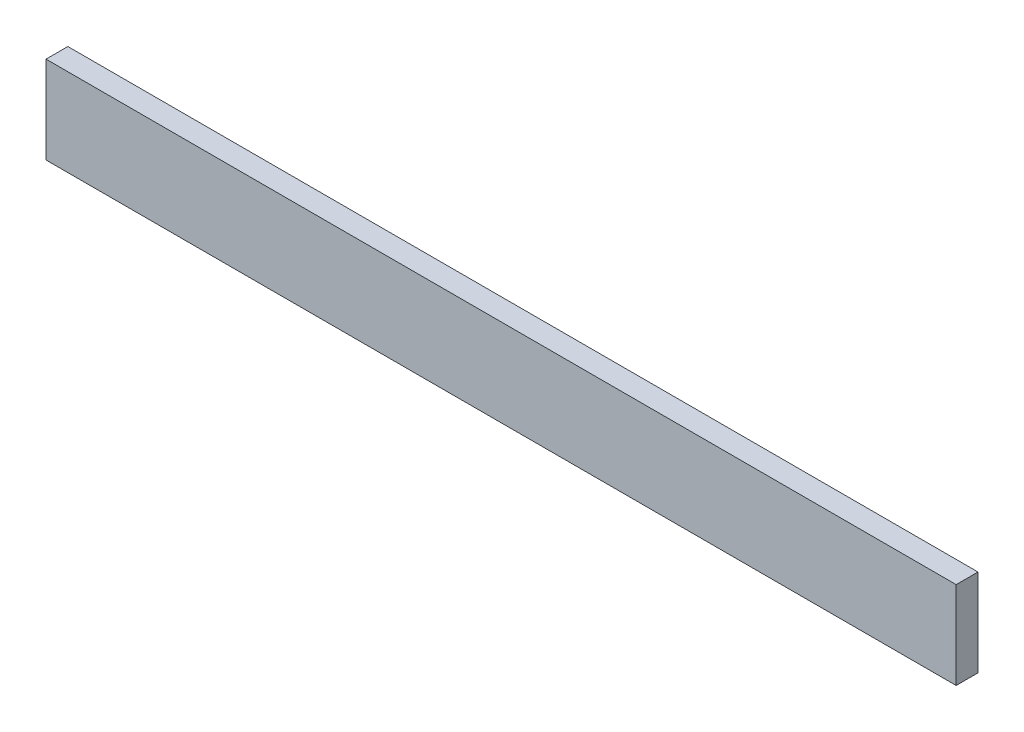
ISO-10303-21;
HEADER;
FILE_DESCRIPTION(('STEP AP214'),'2;1');
FILE_NAME('part.step','',(''),(''),'','','');
FILE_SCHEMA(('AUTOMOTIVE_DESIGN { 1 0 10303 214 1 1 1 1 }'));
ENDSEC;
DATA;
#1=APPLICATION_CONTEXT('core data for automotive mechanical design processes');
#2=APPLICATION_PROTOCOL_DEFINITION('international standard','automotive_design',2000,#1);
#3=PRODUCT_CONTEXT('',#1,'mechanical');
#4=PRODUCT('Part','Part','',(#3));
#5=PRODUCT_RELATED_PRODUCT_CATEGORY('part','',(#4));
#6=PRODUCT_DEFINITION_FORMATION('','',#4);
#7=PRODUCT_DEFINITION_CONTEXT('part definition',#1,'design');
#8=PRODUCT_DEFINITION('design','',#6,#7);
#9=PRODUCT_DEFINITION_SHAPE('','',#8);
#10=(LENGTH_UNIT() NAMED_UNIT(*) SI_UNIT(.MILLI.,.METRE.));
#11=(NAMED_UNIT(*) PLANE_ANGLE_UNIT() SI_UNIT($,.RADIAN.));
#12=(NAMED_UNIT(*) SI_UNIT($,.STERADIAN.) SOLID_ANGLE_UNIT());
#13=UNCERTAINTY_MEASURE_WITH_UNIT(LENGTH_MEASURE(1.E-05),#10,'distance_accuracy_value','');
#14=(GEOMETRIC_REPRESENTATION_CONTEXT(3) GLOBAL_UNCERTAINTY_ASSIGNED_CONTEXT((#13)) GLOBAL_UNIT_ASSIGNED_CONTEXT((#10,
#11,#12)) REPRESENTATION_CONTEXT('',''));
#15=CARTESIAN_POINT('',(0.,0.,0.));
#16=DIRECTION('',(0.,0.,1.));
#17=DIRECTION('',(1.,0.,0.));
#18=AXIS2_PLACEMENT_3D('',#15,#16,#17);
#19=CARTESIAN_POINT('',(29.2226202661208,-12.,3.));
#20=DIRECTION('',(-1.,0.,0.));
#21=DIRECTION('',(0.,0.,1.));
#22=AXIS2_PLACEMENT_3D('',#19,#20,#21);
#23=PLANE('',#22);
#24=DIRECTION('',(0.,1.,0.));
#25=VECTOR('',#24,1.);
#26=CARTESIAN_POINT('',(29.2226202661208,-12.,0.));
#27=LINE('',#26,#25);
#28=CARTESIAN_POINT('',(29.2226202661208,-12.,0.));
#29=VERTEX_POINT('',#28);
#30=CARTESIAN_POINT('',(29.2226202661208,0.,0.));
#31=VERTEX_POINT('',#30);
#32=EDGE_CURVE('E102',#29,#31,#27,.T.);
#33=ORIENTED_EDGE('',*,*,#32,.T.);
#34=DIRECTION('',(0.,0.,-1.));
#35=VECTOR('',#34,1.);
#36=CARTESIAN_POINT('',(29.2226202661208,0.,3.));
#37=LINE('',#36,#35);
#38=CARTESIAN_POINT('',(29.2226202661208,0.,3.));
#39=VERTEX_POINT('',#38);
#40=EDGE_CURVE('E11',#39,#31,#37,.T.);
#41=ORIENTED_EDGE('',*,*,#40,.F.);
#42=DIRECTION('',(0.,1.,0.));
#43=VECTOR('',#42,1.);
#44=CARTESIAN_POINT('',(29.2226202661208,-12.,3.));
#45=LINE('',#44,#43);
#46=CARTESIAN_POINT('',(29.2226202661208,-12.,3.));
#47=VERTEX_POINT('',#46);
#48=EDGE_CURVE('E90',#47,#39,#45,.T.);
#49=ORIENTED_EDGE('',*,*,#48,.F.);
#50=DIRECTION('',(0.,0.,-1.));
#51=VECTOR('',#50,1.);
#52=CARTESIAN_POINT('',(29.2226202661208,-12.,3.));
#53=LINE('',#52,#51);
#54=EDGE_CURVE('E98',#47,#29,#53,.T.);
#55=ORIENTED_EDGE('',*,*,#54,.T.);
#56=EDGE_LOOP('',(#33,#41,#49,#55));
#57=FACE_BOUND('',#56,.T.);
#58=ADVANCED_FACE('F39',(#57),#23,.F.);
#59=CARTESIAN_POINT('',(-83.7773797338792,0.,3.));
#60=DIRECTION('',(0.,-1.,0.));
#61=DIRECTION('',(0.,0.,-1.));
#62=AXIS2_PLACEMENT_3D('',#59,#60,#61);
#63=PLANE('',#62);
#64=DIRECTION('',(-1.,0.,0.));
#65=VECTOR('',#64,1.);
#66=CARTESIAN_POINT('',(-83.7773797338792,0.,0.));
#67=LINE('',#66,#65);
#68=CARTESIAN_POINT('',(-95.7773797338792,0.,0.));
#69=VERTEX_POINT('',#68);
#70=EDGE_CURVE('E94',#31,#69,#67,.T.);
#71=ORIENTED_EDGE('',*,*,#70,.T.);
#72=DIRECTION('',(0.,0.,-1.));
#73=VECTOR('',#72,1.);
#74=CARTESIAN_POINT('',(-95.7773797338792,0.,3.));
#75=LINE('',#74,#73);
#76=CARTESIAN_POINT('',(-95.7773797338792,0.,3.));
#77=VERTEX_POINT('',#76);
#78=EDGE_CURVE('E47',#77,#69,#75,.T.);
#79=ORIENTED_EDGE('',*,*,#78,.F.);
#80=DIRECTION('',(-1.,0.,0.));
#81=VECTOR('',#80,1.);
#82=CARTESIAN_POINT('',(17.2226202661208,0.,3.));
#83=LINE('',#82,#81);
#84=EDGE_CURVE('E85',#39,#77,#83,.T.);
#85=ORIENTED_EDGE('',*,*,#84,.F.);
#86=ORIENTED_EDGE('',*,*,#40,.T.);
#87=EDGE_LOOP('',(#71,#79,#85,#86));
#88=FACE_BOUND('',#87,.T.);
#89=ADVANCED_FACE('F93',(#88),#63,.F.);
#90=CARTESIAN_POINT('',(-95.7773797338792,0.,3.));
#91=DIRECTION('',(1.,0.,0.));
#92=DIRECTION('',(0.,0.,-1.));
#93=AXIS2_PLACEMENT_3D('',#90,#91,#92);
#94=PLANE('',#93);
#95=DIRECTION('',(0.,-1.,0.));
#96=VECTOR('',#95,1.);
#97=CARTESIAN_POINT('',(-95.7773797338792,0.,0.));
#98=LINE('',#97,#96);
#99=CARTESIAN_POINT('',(-95.7773797338792,-12.,0.));
#100=VERTEX_POINT('',#99);
#101=EDGE_CURVE('E72',#69,#100,#98,.T.);
#102=ORIENTED_EDGE('',*,*,#101,.T.);
#103=DIRECTION('',(0.,0.,-1.));
#104=VECTOR('',#103,1.);
#105=CARTESIAN_POINT('',(-95.7773797338792,-12.,3.));
#106=LINE('',#105,#104);
#107=CARTESIAN_POINT('',(-95.7773797338792,-12.,3.));
#108=VERTEX_POINT('',#107);
#109=EDGE_CURVE('E95',#108,#100,#106,.T.);
#110=ORIENTED_EDGE('',*,*,#109,.F.);
#111=DIRECTION('',(0.,-1.,0.));
#112=VECTOR('',#111,1.);
#113=CARTESIAN_POINT('',(-95.7773797338792,0.,3.));
#114=LINE('',#113,#112);
#115=EDGE_CURVE('E88',#77,#108,#114,.T.);
#116=ORIENTED_EDGE('',*,*,#115,.F.);
#117=ORIENTED_EDGE('',*,*,#78,.T.);
#118=EDGE_LOOP('',(#102,#110,#116,#117));
#119=FACE_BOUND('',#118,.T.);
#120=ADVANCED_FACE('F96',(#119),#94,.F.);
#121=CARTESIAN_POINT('',(-95.7773797338792,-12.,3.));
#122=DIRECTION('',(0.,1.,0.));
#123=DIRECTION('',(0.,0.,1.));
#124=AXIS2_PLACEMENT_3D('',#121,#122,#123);
#125=PLANE('',#124);
#126=DIRECTION('',(1.,0.,0.));
#127=VECTOR('',#126,1.);
#128=CARTESIAN_POINT('',(-95.7773797338792,-12.,0.));
#129=LINE('',#128,#127);
#130=EDGE_CURVE('E78',#100,#29,#129,.T.);
#131=ORIENTED_EDGE('',*,*,#130,.T.);
#132=ORIENTED_EDGE('',*,*,#54,.F.);
#133=DIRECTION('',(1.,0.,0.));
#134=VECTOR('',#133,1.);
#135=CARTESIAN_POINT('',(-95.7773797338792,-12.,3.));
#136=LINE('',#135,#134);
#137=EDGE_CURVE('E55',#108,#47,#136,.T.);
#138=ORIENTED_EDGE('',*,*,#137,.F.);
#139=ORIENTED_EDGE('',*,*,#109,.T.);
#140=EDGE_LOOP('',(#131,#132,#138,#139));
#141=FACE_BOUND('',#140,.T.);
#142=ADVANCED_FACE('F109',(#141),#125,.F.);
#143=CARTESIAN_POINT('',(0.,0.,3.));
#144=DIRECTION('',(0.,0.,-1.));
#145=DIRECTION('',(-1.,0.,0.));
#146=AXIS2_PLACEMENT_3D('',#143,#144,#145);
#147=PLANE('',#146);
#148=ORIENTED_EDGE('',*,*,#48,.T.);
#149=ORIENTED_EDGE('',*,*,#84,.T.);
#150=ORIENTED_EDGE('',*,*,#115,.T.);
#151=ORIENTED_EDGE('',*,*,#137,.T.);
#152=EDGE_LOOP('',(#148,#149,#150,#151));
#153=FACE_BOUND('',#152,.T.);
#154=ADVANCED_FACE('F86',(#153),#147,.F.);
#155=CARTESIAN_POINT('',(0.,0.,0.));
#156=DIRECTION('',(0.,0.,-1.));
#157=DIRECTION('',(-1.,0.,0.));
#158=AXIS2_PLACEMENT_3D('',#155,#156,#157);
#159=PLANE('',#158);
#160=ORIENTED_EDGE('',*,*,#32,.F.);
#161=ORIENTED_EDGE('',*,*,#130,.F.);
#162=ORIENTED_EDGE('',*,*,#101,.F.);
#163=ORIENTED_EDGE('',*,*,#70,.F.);
#164=EDGE_LOOP('',(#160,#161,#162,#163));
#165=FACE_BOUND('',#164,.T.);
#166=ADVANCED_FACE('F112',(#165),#159,.T.);
#167=CLOSED_SHELL('',(#58,#89,#120,#142,#154,#166));
#168=MANIFOLD_SOLID_BREP('B2',#167);
#169=ADVANCED_BREP_SHAPE_REPRESENTATION('',(#18,#168),#14);
#170=SHAPE_DEFINITION_REPRESENTATION(#9,#169);
ENDSEC;
END-ISO-10303-21;
